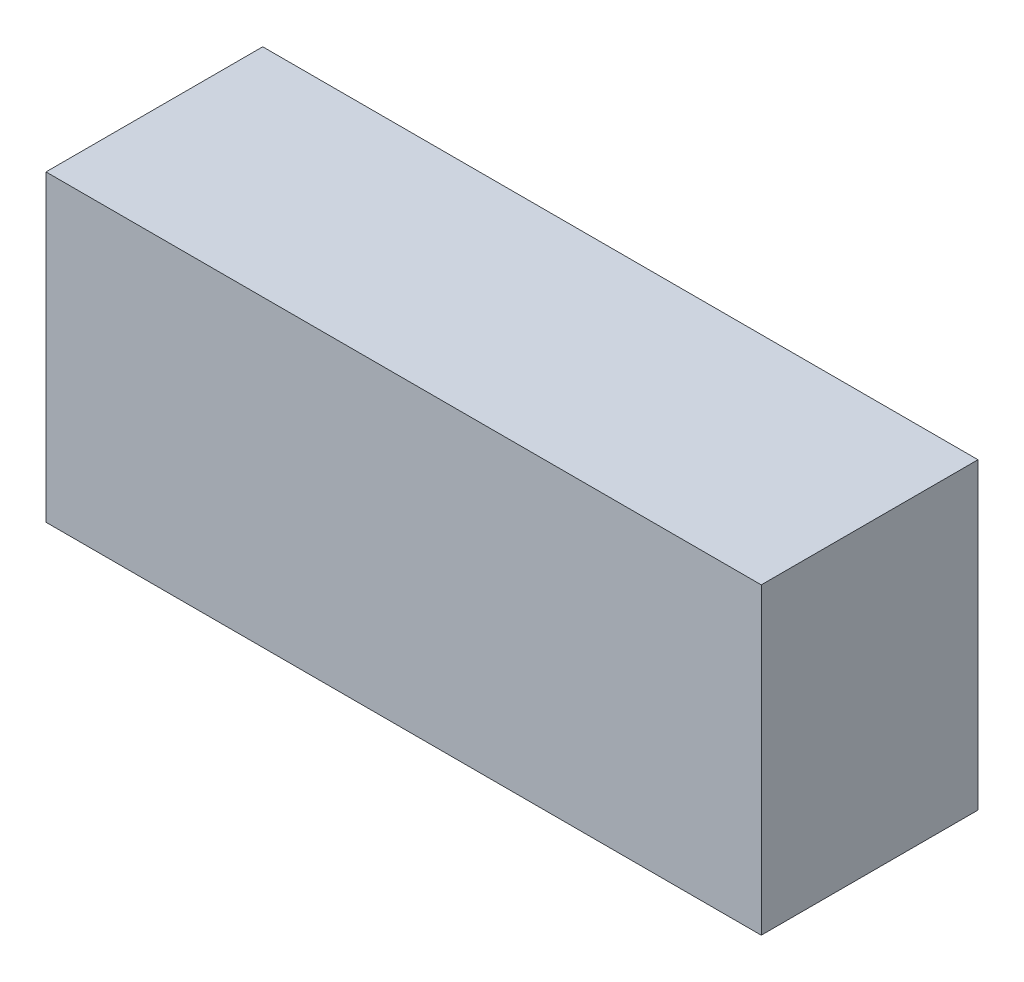
ISO-10303-21;
HEADER;
FILE_DESCRIPTION(('STEP AP214'),'2;1');
FILE_NAME('part.step','',(''),(''),'','','');
FILE_SCHEMA(('AUTOMOTIVE_DESIGN { 1 0 10303 214 1 1 1 1 }'));
ENDSEC;
DATA;
#1=APPLICATION_CONTEXT('core data for automotive mechanical design processes');
#2=APPLICATION_PROTOCOL_DEFINITION('international standard','automotive_design',2000,#1);
#3=PRODUCT_CONTEXT('',#1,'mechanical');
#4=PRODUCT('Part','Part','',(#3));
#5=PRODUCT_RELATED_PRODUCT_CATEGORY('part','',(#4));
#6=PRODUCT_DEFINITION_FORMATION('','',#4);
#7=PRODUCT_DEFINITION_CONTEXT('part definition',#1,'design');
#8=PRODUCT_DEFINITION('design','',#6,#7);
#9=PRODUCT_DEFINITION_SHAPE('','',#8);
#10=(LENGTH_UNIT() NAMED_UNIT(*) SI_UNIT(.MILLI.,.METRE.));
#11=(NAMED_UNIT(*) PLANE_ANGLE_UNIT() SI_UNIT($,.RADIAN.));
#12=(NAMED_UNIT(*) SI_UNIT($,.STERADIAN.) SOLID_ANGLE_UNIT());
#13=UNCERTAINTY_MEASURE_WITH_UNIT(LENGTH_MEASURE(1.E-05),#10,'distance_accuracy_value','');
#14=(GEOMETRIC_REPRESENTATION_CONTEXT(3) GLOBAL_UNCERTAINTY_ASSIGNED_CONTEXT((#13)) GLOBAL_UNIT_ASSIGNED_CONTEXT((#10,
#11,#12)) REPRESENTATION_CONTEXT('',''));
#15=CARTESIAN_POINT('',(0.,0.,0.));
#16=DIRECTION('',(0.,0.,1.));
#17=DIRECTION('',(1.,0.,0.));
#18=AXIS2_PLACEMENT_3D('',#15,#16,#17);
#19=CARTESIAN_POINT('',(82.5,-35.,50.));
#20=DIRECTION('',(-1.,0.,0.));
#21=DIRECTION('',(0.,0.,1.));
#22=AXIS2_PLACEMENT_3D('',#19,#20,#21);
#23=PLANE('',#22);
#24=DIRECTION('',(0.,1.,0.));
#25=VECTOR('',#24,1.);
#26=CARTESIAN_POINT('',(82.5,-35.,0.));
#27=LINE('',#26,#25);
#28=CARTESIAN_POINT('',(82.5,-35.,0.));
#29=VERTEX_POINT('',#28);
#30=CARTESIAN_POINT('',(82.5,35.,0.));
#31=VERTEX_POINT('',#30);
#32=EDGE_CURVE('E113',#29,#31,#27,.T.);
#33=ORIENTED_EDGE('',*,*,#32,.T.);
#34=DIRECTION('',(0.,0.,-1.));
#35=VECTOR('',#34,1.);
#36=CARTESIAN_POINT('',(82.5,35.,50.));
#37=LINE('',#36,#35);
#38=CARTESIAN_POINT('',(82.5,35.,50.));
#39=VERTEX_POINT('',#38);
#40=EDGE_CURVE('E11',#39,#31,#37,.T.);
#41=ORIENTED_EDGE('',*,*,#40,.F.);
#42=DIRECTION('',(0.,1.,0.));
#43=VECTOR('',#42,1.);
#44=CARTESIAN_POINT('',(82.5,-35.,50.));
#45=LINE('',#44,#43);
#46=CARTESIAN_POINT('',(82.5,-35.,50.));
#47=VERTEX_POINT('',#46);
#48=EDGE_CURVE('E97',#47,#39,#45,.T.);
#49=ORIENTED_EDGE('',*,*,#48,.F.);
#50=DIRECTION('',(0.,0.,-1.));
#51=VECTOR('',#50,1.);
#52=CARTESIAN_POINT('',(82.5,-35.,50.));
#53=LINE('',#52,#51);
#54=EDGE_CURVE('E109',#47,#29,#53,.T.);
#55=ORIENTED_EDGE('',*,*,#54,.T.);
#56=EDGE_LOOP('',(#33,#41,#49,#55));
#57=FACE_BOUND('',#56,.T.);
#58=ADVANCED_FACE('F45',(#57),#23,.F.);
#59=CARTESIAN_POINT('',(-82.5,35.,50.));
#60=DIRECTION('',(0.,-1.,0.));
#61=DIRECTION('',(0.,0.,-1.));
#62=AXIS2_PLACEMENT_3D('',#59,#60,#61);
#63=PLANE('',#62);
#64=DIRECTION('',(-1.,0.,0.));
#65=VECTOR('',#64,1.);
#66=CARTESIAN_POINT('',(-82.5,35.,0.));
#67=LINE('',#66,#65);
#68=CARTESIAN_POINT('',(-82.5,35.,0.));
#69=VERTEX_POINT('',#68);
#70=EDGE_CURVE('E102',#31,#69,#67,.T.);
#71=ORIENTED_EDGE('',*,*,#70,.T.);
#72=DIRECTION('',(0.,0.,-1.));
#73=VECTOR('',#72,1.);
#74=CARTESIAN_POINT('',(-82.5,35.,50.));
#75=LINE('',#74,#73);
#76=CARTESIAN_POINT('',(-82.5,35.,50.));
#77=VERTEX_POINT('',#76);
#78=EDGE_CURVE('E54',#77,#69,#75,.T.);
#79=ORIENTED_EDGE('',*,*,#78,.F.);
#80=DIRECTION('',(-1.,0.,0.));
#81=VECTOR('',#80,1.);
#82=CARTESIAN_POINT('',(-82.5,35.,50.));
#83=LINE('',#82,#81);
#84=EDGE_CURVE('E92',#39,#77,#83,.T.);
#85=ORIENTED_EDGE('',*,*,#84,.F.);
#86=ORIENTED_EDGE('',*,*,#40,.T.);
#87=EDGE_LOOP('',(#71,#79,#85,#86));
#88=FACE_BOUND('',#87,.T.);
#89=ADVANCED_FACE('F101',(#88),#63,.F.);
#90=CARTESIAN_POINT('',(-82.5,-35.,50.));
#91=DIRECTION('',(1.,0.,0.));
#92=DIRECTION('',(0.,0.,-1.));
#93=AXIS2_PLACEMENT_3D('',#90,#91,#92);
#94=PLANE('',#93);
#95=DIRECTION('',(0.,-1.,0.));
#96=VECTOR('',#95,1.);
#97=CARTESIAN_POINT('',(-82.5,-35.,0.));
#98=LINE('',#97,#96);
#99=CARTESIAN_POINT('',(-82.5,-35.,0.));
#100=VERTEX_POINT('',#99);
#101=EDGE_CURVE('E79',#69,#100,#98,.T.);
#102=ORIENTED_EDGE('',*,*,#101,.T.);
#103=DIRECTION('',(0.,0.,-1.));
#104=VECTOR('',#103,1.);
#105=CARTESIAN_POINT('',(-82.5,-35.,50.));
#106=LINE('',#105,#104);
#107=CARTESIAN_POINT('',(-82.5,-35.,50.));
#108=VERTEX_POINT('',#107);
#109=EDGE_CURVE('E104',#108,#100,#106,.T.);
#110=ORIENTED_EDGE('',*,*,#109,.F.);
#111=DIRECTION('',(0.,-1.,0.));
#112=VECTOR('',#111,1.);
#113=CARTESIAN_POINT('',(-82.5,-35.,50.));
#114=LINE('',#113,#112);
#115=EDGE_CURVE('E95',#77,#108,#114,.T.);
#116=ORIENTED_EDGE('',*,*,#115,.F.);
#117=ORIENTED_EDGE('',*,*,#78,.T.);
#118=EDGE_LOOP('',(#102,#110,#116,#117));
#119=FACE_BOUND('',#118,.T.);
#120=ADVANCED_FACE('F105',(#119),#94,.F.);
#121=CARTESIAN_POINT('',(-82.5,-35.,50.));
#122=DIRECTION('',(0.,1.,0.));
#123=DIRECTION('',(0.,0.,1.));
#124=AXIS2_PLACEMENT_3D('',#121,#122,#123);
#125=PLANE('',#124);
#126=DIRECTION('',(1.,0.,0.));
#127=VECTOR('',#126,1.);
#128=CARTESIAN_POINT('',(-82.5,-35.,0.));
#129=LINE('',#128,#127);
#130=EDGE_CURVE('E85',#100,#29,#129,.T.);
#131=ORIENTED_EDGE('',*,*,#130,.T.);
#132=ORIENTED_EDGE('',*,*,#54,.F.);
#133=DIRECTION('',(1.,0.,0.));
#134=VECTOR('',#133,1.);
#135=CARTESIAN_POINT('',(-82.5,-35.,50.));
#136=LINE('',#135,#134);
#137=EDGE_CURVE('E62',#108,#47,#136,.T.);
#138=ORIENTED_EDGE('',*,*,#137,.F.);
#139=ORIENTED_EDGE('',*,*,#109,.T.);
#140=EDGE_LOOP('',(#131,#132,#138,#139));
#141=FACE_BOUND('',#140,.T.);
#142=ADVANCED_FACE('F126',(#141),#125,.F.);
#143=CARTESIAN_POINT('',(0.,0.,50.));
#144=DIRECTION('',(0.,0.,-1.));
#145=DIRECTION('',(-1.,0.,0.));
#146=AXIS2_PLACEMENT_3D('',#143,#144,#145);
#147=PLANE('',#146);
#148=ORIENTED_EDGE('',*,*,#48,.T.);
#149=ORIENTED_EDGE('',*,*,#84,.T.);
#150=ORIENTED_EDGE('',*,*,#115,.T.);
#151=ORIENTED_EDGE('',*,*,#137,.T.);
#152=EDGE_LOOP('',(#148,#149,#150,#151));
#153=FACE_BOUND('',#152,.T.);
#154=ADVANCED_FACE('F93',(#153),#147,.F.);
#155=CARTESIAN_POINT('',(0.,0.,0.));
#156=DIRECTION('',(0.,0.,-1.));
#157=DIRECTION('',(-1.,0.,0.));
#158=AXIS2_PLACEMENT_3D('',#155,#156,#157);
#159=PLANE('',#158);
#160=ORIENTED_EDGE('',*,*,#32,.F.);
#161=ORIENTED_EDGE('',*,*,#130,.F.);
#162=ORIENTED_EDGE('',*,*,#101,.F.);
#163=ORIENTED_EDGE('',*,*,#70,.F.);
#164=EDGE_LOOP('',(#160,#161,#162,#163));
#165=FACE_BOUND('',#164,.T.);
#166=ADVANCED_FACE('F129',(#165),#159,.T.);
#167=CLOSED_SHELL('',(#58,#89,#120,#142,#154,#166));
#168=MANIFOLD_SOLID_BREP('B2',#167);
#169=ADVANCED_BREP_SHAPE_REPRESENTATION('',(#18,#168),#14);
#170=SHAPE_DEFINITION_REPRESENTATION(#9,#169);
ENDSEC;
END-ISO-10303-21;
